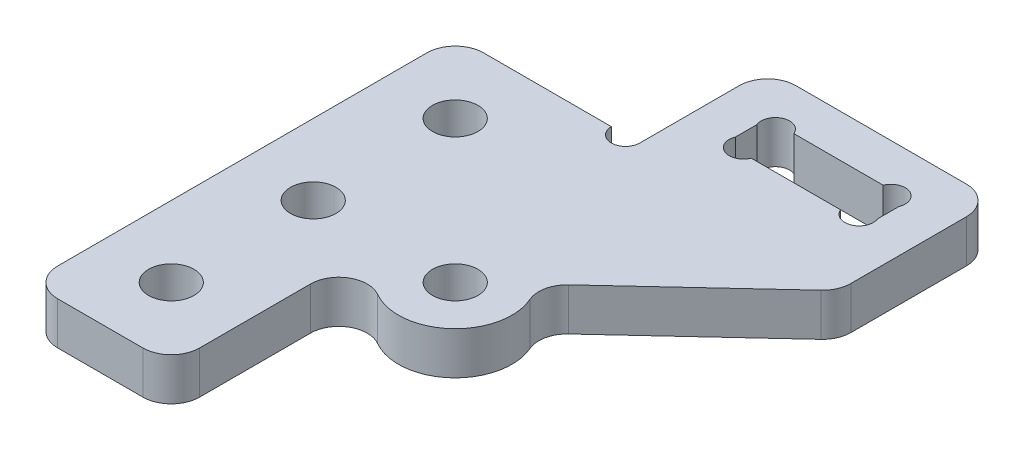
ISO-10303-21;
HEADER;
FILE_DESCRIPTION(('STEP AP214'),'2;1');
FILE_NAME('part.step','',(''),(''),'','','');
FILE_SCHEMA(('AUTOMOTIVE_DESIGN { 1 0 10303 214 1 1 1 1 }'));
ENDSEC;
DATA;
#1=APPLICATION_CONTEXT('core data for automotive mechanical design processes');
#2=APPLICATION_PROTOCOL_DEFINITION('international standard','automotive_design',2000,#1);
#3=PRODUCT_CONTEXT('',#1,'mechanical');
#4=PRODUCT('Part','Part','',(#3));
#5=PRODUCT_RELATED_PRODUCT_CATEGORY('part','',(#4));
#6=PRODUCT_DEFINITION_FORMATION('','',#4);
#7=PRODUCT_DEFINITION_CONTEXT('part definition',#1,'design');
#8=PRODUCT_DEFINITION('design','',#6,#7);
#9=PRODUCT_DEFINITION_SHAPE('','',#8);
#10=(LENGTH_UNIT() NAMED_UNIT(*) SI_UNIT(.MILLI.,.METRE.));
#11=(NAMED_UNIT(*) PLANE_ANGLE_UNIT() SI_UNIT($,.RADIAN.));
#12=(NAMED_UNIT(*) SI_UNIT($,.STERADIAN.) SOLID_ANGLE_UNIT());
#13=UNCERTAINTY_MEASURE_WITH_UNIT(LENGTH_MEASURE(1.E-05),#10,'distance_accuracy_value','');
#14=(GEOMETRIC_REPRESENTATION_CONTEXT(3) GLOBAL_UNCERTAINTY_ASSIGNED_CONTEXT((#13)) GLOBAL_UNIT_ASSIGNED_CONTEXT((#10,
#11,#12)) REPRESENTATION_CONTEXT('',''));
#15=CARTESIAN_POINT('',(0.,0.,0.));
#16=DIRECTION('',(0.,0.,1.));
#17=DIRECTION('',(1.,0.,0.));
#18=AXIS2_PLACEMENT_3D('',#15,#16,#17);
#19=CARTESIAN_POINT('',(0.,3.,0.));
#20=DIRECTION('',(0.,-1.,0.));
#21=DIRECTION('',(0.,0.,-1.));
#22=AXIS2_PLACEMENT_3D('',#19,#20,#21);
#23=PLANE('',#22);
#24=DIRECTION('',(-1.,0.,0.));
#25=VECTOR('',#24,1.);
#26=CARTESIAN_POINT('',(24.,3.,-24.));
#27=LINE('',#26,#25);
#28=CARTESIAN_POINT('',(22.,3.,-24.));
#29=VERTEX_POINT('',#28);
#30=CARTESIAN_POINT('',(10.,3.,-24.));
#31=VERTEX_POINT('',#30);
#32=EDGE_CURVE('E411',#29,#31,#27,.T.);
#33=ORIENTED_EDGE('',*,*,#32,.T.);
#34=CARTESIAN_POINT('',(10.,3.,-22.));
#35=DIRECTION('',(0.,-1.,0.));
#36=DIRECTION('',(0.,0.,-1.));
#37=AXIS2_PLACEMENT_3D('',#34,#35,#36);
#38=CIRCLE('',#37,2.);
#39=CARTESIAN_POINT('',(8.,3.,-22.));
#40=VERTEX_POINT('',#39);
#41=EDGE_CURVE('E358',#31,#40,#38,.F.);
#42=ORIENTED_EDGE('',*,*,#41,.T.);
#43=DIRECTION('',(0.,0.,1.));
#44=VECTOR('',#43,1.);
#45=CARTESIAN_POINT('',(8.,3.,-15.));
#46=LINE('',#45,#44);
#47=CARTESIAN_POINT('',(8.,3.,-15.));
#48=VERTEX_POINT('',#47);
#49=EDGE_CURVE('E431',#40,#48,#46,.T.);
#50=ORIENTED_EDGE('',*,*,#49,.T.);
#51=CARTESIAN_POINT('',(7.,3.,-15.));
#52=DIRECTION('',(0.,-1.,0.));
#53=DIRECTION('',(0.,0.,-1.));
#54=AXIS2_PLACEMENT_3D('',#51,#52,#53);
#55=CIRCLE('',#54,1.);
#56=CARTESIAN_POINT('',(6.,3.,-15.));
#57=VERTEX_POINT('',#56);
#58=EDGE_CURVE('E457',#48,#57,#55,.T.);
#59=ORIENTED_EDGE('',*,*,#58,.T.);
#60=DIRECTION('',(-1.,0.,0.));
#61=VECTOR('',#60,1.);
#62=CARTESIAN_POINT('',(-5.,3.,-15.));
#63=LINE('',#62,#61);
#64=CARTESIAN_POINT('',(-3.,3.,-15.));
#65=VERTEX_POINT('',#64);
#66=EDGE_CURVE('E300',#57,#65,#63,.T.);
#67=ORIENTED_EDGE('',*,*,#66,.T.);
#68=CARTESIAN_POINT('',(-3.,3.,-13.));
#69=DIRECTION('',(0.,-1.,0.));
#70=DIRECTION('',(0.,0.,-1.));
#71=AXIS2_PLACEMENT_3D('',#68,#69,#70);
#72=CIRCLE('',#71,2.);
#73=CARTESIAN_POINT('',(-5.,3.,-13.));
#74=VERTEX_POINT('',#73);
#75=EDGE_CURVE('E349',#65,#74,#72,.F.);
#76=ORIENTED_EDGE('',*,*,#75,.T.);
#77=DIRECTION('',(0.,0.,1.));
#78=VECTOR('',#77,1.);
#79=CARTESIAN_POINT('',(-5.,3.,15.));
#80=LINE('',#79,#78);
#81=CARTESIAN_POINT('',(-5.,3.,13.));
#82=VERTEX_POINT('',#81);
#83=EDGE_CURVE('E304',#74,#82,#80,.T.);
#84=ORIENTED_EDGE('',*,*,#83,.T.);
#85=CARTESIAN_POINT('',(-3.,3.,13.));
#86=DIRECTION('',(0.,-1.,0.));
#87=DIRECTION('',(0.,0.,-1.));
#88=AXIS2_PLACEMENT_3D('',#85,#86,#87);
#89=CIRCLE('',#88,2.);
#90=CARTESIAN_POINT('',(-3.,3.,15.));
#91=VERTEX_POINT('',#90);
#92=EDGE_CURVE('E351',#82,#91,#89,.F.);
#93=ORIENTED_EDGE('',*,*,#92,.T.);
#94=DIRECTION('',(1.,0.,0.));
#95=VECTOR('',#94,1.);
#96=CARTESIAN_POINT('',(-5.,3.,15.));
#97=LINE('',#96,#95);
#98=CARTESIAN_POINT('',(3.,3.,15.));
#99=VERTEX_POINT('',#98);
#100=EDGE_CURVE('E307',#91,#99,#97,.T.);
#101=ORIENTED_EDGE('',*,*,#100,.T.);
#102=CARTESIAN_POINT('',(3.,3.,13.));
#103=DIRECTION('',(0.,-1.,0.));
#104=DIRECTION('',(0.,0.,-1.));
#105=AXIS2_PLACEMENT_3D('',#102,#103,#104);
#106=CIRCLE('',#105,2.);
#107=CARTESIAN_POINT('',(5.,3.,13.));
#108=VERTEX_POINT('',#107);
#109=EDGE_CURVE('E353',#99,#108,#106,.F.);
#110=ORIENTED_EDGE('',*,*,#109,.T.);
#111=DIRECTION('',(0.,0.,-1.));
#112=VECTOR('',#111,1.);
#113=CARTESIAN_POINT('',(5.,3.,15.));
#114=LINE('',#113,#112);
#115=CARTESIAN_POINT('',(5.,3.,5.19615242270663));
#116=VERTEX_POINT('',#115);
#117=EDGE_CURVE('E298',#108,#116,#114,.T.);
#118=ORIENTED_EDGE('',*,*,#117,.T.);
#119=CARTESIAN_POINT('',(7.,3.,5.19615242270663));
#120=DIRECTION('',(0.,-1.,0.));
#121=DIRECTION('',(0.,0.,-1.));
#122=AXIS2_PLACEMENT_3D('',#119,#120,#121);
#123=CIRCLE('',#122,2.);
#124=CARTESIAN_POINT('',(8.,3.,3.46410161513776));
#125=VERTEX_POINT('',#124);
#126=EDGE_CURVE('E409',#116,#125,#123,.T.);
#127=ORIENTED_EDGE('',*,*,#126,.T.);
#128=CARTESIAN_POINT('',(10.,3.,0.));
#129=DIRECTION('',(0.,-1.,0.));
#130=DIRECTION('',(0.,0.,-1.));
#131=AXIS2_PLACEMENT_3D('',#128,#129,#130);
#132=CIRCLE('',#131,4.);
#133=CARTESIAN_POINT('',(13.6708054505608,3.,-1.58908380651663));
#134=VERTEX_POINT('',#133);
#135=EDGE_CURVE('E403',#125,#134,#132,.F.);
#136=ORIENTED_EDGE('',*,*,#135,.T.);
#137=CARTESIAN_POINT('',(15.5062081758411,3.,-2.38362570977495));
#138=DIRECTION('',(0.,-1.,0.));
#139=DIRECTION('',(0.,0.,-1.));
#140=AXIS2_PLACEMENT_3D('',#137,#138,#139);
#141=CIRCLE('',#140,2.);
#142=CARTESIAN_POINT('',(14.1453059771066,3.,-3.84921269302754));
#143=VERTEX_POINT('',#142);
#144=EDGE_CURVE('E11',#134,#143,#141,.T.);
#145=ORIENTED_EDGE('',*,*,#144,.T.);
#146=DIRECTION('',(0.732793491626299,0.,-0.680451099367278));
#147=VECTOR('',#146,1.);
#148=CARTESIAN_POINT('',(12.9311739665052,3.,-2.72180439746911));
#149=LINE('',#148,#147);
#150=CARTESIAN_POINT('',(23.3609021987346,3.,-12.4065520416821));
#151=VERTEX_POINT('',#150);
#152=EDGE_CURVE('E402',#143,#151,#149,.T.);
#153=ORIENTED_EDGE('',*,*,#152,.T.);
#154=CARTESIAN_POINT('',(22.,3.,-13.8721390249347));
#155=DIRECTION('',(0.,-1.,0.));
#156=DIRECTION('',(0.,0.,-1.));
#157=AXIS2_PLACEMENT_3D('',#154,#155,#156);
#158=CIRCLE('',#157,2.);
#159=CARTESIAN_POINT('',(24.,3.,-13.8721390249347));
#160=VERTEX_POINT('',#159);
#161=EDGE_CURVE('E56',#151,#160,#158,.F.);
#162=ORIENTED_EDGE('',*,*,#161,.T.);
#163=DIRECTION('',(0.,0.,-1.));
#164=VECTOR('',#163,1.);
#165=CARTESIAN_POINT('',(24.,3.,-13.));
#166=LINE('',#165,#164);
#167=CARTESIAN_POINT('',(24.,3.,-22.));
#168=VERTEX_POINT('',#167);
#169=EDGE_CURVE('E407',#160,#168,#166,.T.);
#170=ORIENTED_EDGE('',*,*,#169,.T.);
#171=CARTESIAN_POINT('',(22.,3.,-22.));
#172=DIRECTION('',(0.,-1.,0.));
#173=DIRECTION('',(0.,0.,-1.));
#174=AXIS2_PLACEMENT_3D('',#171,#172,#173);
#175=CIRCLE('',#174,2.);
#176=EDGE_CURVE('E356',#168,#29,#175,.F.);
#177=ORIENTED_EDGE('',*,*,#176,.T.);
#178=EDGE_LOOP('',(#33,#42,#50,#59,#67,#76,#84,#93,#101,#110,#118,#127,#136,#145,#153,#162,#170,#177));
#179=FACE_BOUND('',#178,.T.);
#180=CARTESIAN_POINT('',(0.,3.,0.));
#181=DIRECTION('',(0.,1.,0.));
#182=DIRECTION('',(0.,0.,1.));
#183=AXIS2_PLACEMENT_3D('',#180,#181,#182);
#184=CIRCLE('',#183,1.6);
#185=CARTESIAN_POINT('',(0.,3.,1.6));
#186=VERTEX_POINT('',#185);
#187=EDGE_CURVE('E292',#186,#186,#184,.T.);
#188=ORIENTED_EDGE('',*,*,#187,.F.);
#189=EDGE_LOOP('',(#188));
#190=FACE_BOUND('',#189,.T.);
#191=CARTESIAN_POINT('',(0.,3.,-10.));
#192=DIRECTION('',(0.,1.,0.));
#193=DIRECTION('',(0.,0.,1.));
#194=AXIS2_PLACEMENT_3D('',#191,#192,#193);
#195=CIRCLE('',#194,1.6);
#196=CARTESIAN_POINT('',(0.,3.,-8.4));
#197=VERTEX_POINT('',#196);
#198=EDGE_CURVE('E286',#197,#197,#195,.T.);
#199=ORIENTED_EDGE('',*,*,#198,.F.);
#200=EDGE_LOOP('',(#199));
#201=FACE_BOUND('',#200,.T.);
#202=CARTESIAN_POINT('',(0.,3.,10.));
#203=DIRECTION('',(0.,1.,0.));
#204=DIRECTION('',(0.,0.,-1.));
#205=AXIS2_PLACEMENT_3D('',#202,#203,#204);
#206=CIRCLE('',#205,1.6);
#207=CARTESIAN_POINT('',(0.,3.,8.4));
#208=VERTEX_POINT('',#207);
#209=EDGE_CURVE('E280',#208,#208,#206,.T.);
#210=ORIENTED_EDGE('',*,*,#209,.F.);
#211=EDGE_LOOP('',(#210));
#212=FACE_BOUND('',#211,.T.);
#213=CARTESIAN_POINT('',(10.,3.,0.));
#214=DIRECTION('',(0.,-1.,0.));
#215=DIRECTION('',(0.,0.,-1.));
#216=AXIS2_PLACEMENT_3D('',#213,#214,#215);
#217=CIRCLE('',#216,1.6);
#218=CARTESIAN_POINT('',(10.,3.,-1.6));
#219=VERTEX_POINT('',#218);
#220=EDGE_CURVE('E275',#219,#219,#217,.F.);
#221=ORIENTED_EDGE('',*,*,#220,.F.);
#222=EDGE_LOOP('',(#221));
#223=FACE_BOUND('',#222,.T.);
#224=DIRECTION('',(1.,0.,0.));
#225=VECTOR('',#224,1.);
#226=CARTESIAN_POINT('',(11.,3.,-18.));
#227=LINE('',#226,#225);
#228=CARTESIAN_POINT('',(12.8540496217739,3.,-18.));
#229=VERTEX_POINT('',#228);
#230=CARTESIAN_POINT('',(19.1459503782261,3.,-18.));
#231=VERTEX_POINT('',#230);
#232=EDGE_CURVE('E434',#229,#231,#227,.T.);
#233=ORIENTED_EDGE('',*,*,#232,.F.);
#234=CARTESIAN_POINT('',(11.927024810887,3.,-18.375));
#235=DIRECTION('',(0.,-1.,0.));
#236=DIRECTION('',(0.,0.,1.));
#237=AXIS2_PLACEMENT_3D('',#234,#235,#236);
#238=CIRCLE('',#237,1.);
#239=CARTESIAN_POINT('',(11.,3.,-18.75));
#240=VERTEX_POINT('',#239);
#241=EDGE_CURVE('E463',#229,#240,#238,.T.);
#242=ORIENTED_EDGE('',*,*,#241,.T.);
#243=DIRECTION('',(0.,0.,1.));
#244=VECTOR('',#243,1.);
#245=CARTESIAN_POINT('',(11.,3.,-18.));
#246=LINE('',#245,#244);
#247=CARTESIAN_POINT('',(11.,3.,-20.25));
#248=VERTEX_POINT('',#247);
#249=EDGE_CURVE('E415',#248,#240,#246,.T.);
#250=ORIENTED_EDGE('',*,*,#249,.F.);
#251=CARTESIAN_POINT('',(11.927024810887,3.,-20.625));
#252=DIRECTION('',(0.,-1.,0.));
#253=DIRECTION('',(0.,0.,-1.));
#254=AXIS2_PLACEMENT_3D('',#251,#252,#253);
#255=CIRCLE('',#254,1.);
#256=CARTESIAN_POINT('',(12.8540496217739,3.,-21.));
#257=VERTEX_POINT('',#256);
#258=EDGE_CURVE('E218',#248,#257,#255,.T.);
#259=ORIENTED_EDGE('',*,*,#258,.T.);
#260=DIRECTION('',(-1.,0.,0.));
#261=VECTOR('',#260,1.);
#262=CARTESIAN_POINT('',(11.,3.,-21.));
#263=LINE('',#262,#261);
#264=CARTESIAN_POINT('',(19.1459503782261,3.,-21.));
#265=VERTEX_POINT('',#264);
#266=EDGE_CURVE('E228',#265,#257,#263,.T.);
#267=ORIENTED_EDGE('',*,*,#266,.F.);
#268=CARTESIAN_POINT('',(20.072975189113,3.,-20.625));
#269=DIRECTION('',(0.,-1.,0.));
#270=DIRECTION('',(0.,0.,1.));
#271=AXIS2_PLACEMENT_3D('',#268,#269,#270);
#272=CIRCLE('',#271,1.);
#273=CARTESIAN_POINT('',(21.,3.,-20.25));
#274=VERTEX_POINT('',#273);
#275=EDGE_CURVE('E219',#265,#274,#272,.T.);
#276=ORIENTED_EDGE('',*,*,#275,.T.);
#277=DIRECTION('',(0.,0.,-1.));
#278=VECTOR('',#277,1.);
#279=CARTESIAN_POINT('',(21.,3.,-18.));
#280=LINE('',#279,#278);
#281=CARTESIAN_POINT('',(21.,3.,-18.75));
#282=VERTEX_POINT('',#281);
#283=EDGE_CURVE('E279',#282,#274,#280,.T.);
#284=ORIENTED_EDGE('',*,*,#283,.F.);
#285=CARTESIAN_POINT('',(20.072975189113,3.,-18.375));
#286=DIRECTION('',(0.,-1.,0.));
#287=DIRECTION('',(0.,0.,-1.));
#288=AXIS2_PLACEMENT_3D('',#285,#286,#287);
#289=CIRCLE('',#288,1.);
#290=EDGE_CURVE('E230',#282,#231,#289,.T.);
#291=ORIENTED_EDGE('',*,*,#290,.T.);
#292=EDGE_LOOP('',(#233,#242,#250,#259,#267,#276,#284,#291));
#293=FACE_BOUND('',#292,.T.);
#294=ADVANCED_FACE('F34',(#179,#190,#201,#212,#223,#293),#23,.F.);
#295=CARTESIAN_POINT('',(0.,0.,0.));
#296=DIRECTION('',(0.,-1.,0.));
#297=DIRECTION('',(0.,0.,-1.));
#298=AXIS2_PLACEMENT_3D('',#295,#296,#297);
#299=PLANE('',#298);
#300=CARTESIAN_POINT('',(11.927024810887,0.,-18.375));
#301=DIRECTION('',(0.,-1.,0.));
#302=DIRECTION('',(0.,0.,1.));
#303=AXIS2_PLACEMENT_3D('',#300,#301,#302);
#304=CIRCLE('',#303,1.);
#305=CARTESIAN_POINT('',(12.8540496217739,0.,-18.));
#306=VERTEX_POINT('',#305);
#307=CARTESIAN_POINT('',(11.,0.,-18.75));
#308=VERTEX_POINT('',#307);
#309=EDGE_CURVE('E466',#306,#308,#304,.T.);
#310=ORIENTED_EDGE('',*,*,#309,.F.);
#311=DIRECTION('',(-1.,0.,0.));
#312=VECTOR('',#311,1.);
#313=CARTESIAN_POINT('',(11.,0.,-18.));
#314=LINE('',#313,#312);
#315=CARTESIAN_POINT('',(19.1459503782261,0.,-18.));
#316=VERTEX_POINT('',#315);
#317=EDGE_CURVE('E242',#316,#306,#314,.T.);
#318=ORIENTED_EDGE('',*,*,#317,.F.);
#319=CARTESIAN_POINT('',(20.072975189113,0.,-18.375));
#320=DIRECTION('',(0.,-1.,0.));
#321=DIRECTION('',(0.,0.,-1.));
#322=AXIS2_PLACEMENT_3D('',#319,#320,#321);
#323=CIRCLE('',#322,1.);
#324=CARTESIAN_POINT('',(21.,0.,-18.75));
#325=VERTEX_POINT('',#324);
#326=EDGE_CURVE('E465',#325,#316,#323,.T.);
#327=ORIENTED_EDGE('',*,*,#326,.F.);
#328=DIRECTION('',(0.,0.,1.));
#329=VECTOR('',#328,1.);
#330=CARTESIAN_POINT('',(21.,0.,-18.));
#331=LINE('',#330,#329);
#332=CARTESIAN_POINT('',(21.,0.,-20.25));
#333=VERTEX_POINT('',#332);
#334=EDGE_CURVE('E238',#333,#325,#331,.T.);
#335=ORIENTED_EDGE('',*,*,#334,.F.);
#336=CARTESIAN_POINT('',(20.072975189113,0.,-20.625));
#337=DIRECTION('',(0.,-1.,0.));
#338=DIRECTION('',(0.,0.,1.));
#339=AXIS2_PLACEMENT_3D('',#336,#337,#338);
#340=CIRCLE('',#339,1.);
#341=CARTESIAN_POINT('',(19.1459503782261,0.,-21.));
#342=VERTEX_POINT('',#341);
#343=EDGE_CURVE('E237',#342,#333,#340,.T.);
#344=ORIENTED_EDGE('',*,*,#343,.F.);
#345=DIRECTION('',(1.,0.,0.));
#346=VECTOR('',#345,1.);
#347=CARTESIAN_POINT('',(11.,0.,-21.));
#348=LINE('',#347,#346);
#349=CARTESIAN_POINT('',(12.8540496217739,0.,-21.));
#350=VERTEX_POINT('',#349);
#351=EDGE_CURVE('E226',#350,#342,#348,.T.);
#352=ORIENTED_EDGE('',*,*,#351,.F.);
#353=CARTESIAN_POINT('',(11.927024810887,0.,-20.625));
#354=DIRECTION('',(0.,-1.,0.));
#355=DIRECTION('',(0.,0.,-1.));
#356=AXIS2_PLACEMENT_3D('',#353,#354,#355);
#357=CIRCLE('',#356,1.);
#358=CARTESIAN_POINT('',(11.,0.,-20.25));
#359=VERTEX_POINT('',#358);
#360=EDGE_CURVE('E207',#359,#350,#357,.T.);
#361=ORIENTED_EDGE('',*,*,#360,.F.);
#362=DIRECTION('',(0.,0.,-1.));
#363=VECTOR('',#362,1.);
#364=CARTESIAN_POINT('',(11.,0.,-18.));
#365=LINE('',#364,#363);
#366=EDGE_CURVE('E239',#308,#359,#365,.T.);
#367=ORIENTED_EDGE('',*,*,#366,.F.);
#368=EDGE_LOOP('',(#310,#318,#327,#335,#344,#352,#361,#367));
#369=FACE_BOUND('',#368,.T.);
#370=DIRECTION('',(0.,0.,-1.));
#371=VECTOR('',#370,1.);
#372=CARTESIAN_POINT('',(8.,0.,-15.));
#373=LINE('',#372,#371);
#374=CARTESIAN_POINT('',(8.,0.,-15.));
#375=VERTEX_POINT('',#374);
#376=CARTESIAN_POINT('',(8.,0.,-22.));
#377=VERTEX_POINT('',#376);
#378=EDGE_CURVE('E253',#375,#377,#373,.T.);
#379=ORIENTED_EDGE('',*,*,#378,.T.);
#380=CARTESIAN_POINT('',(10.,0.,-22.));
#381=DIRECTION('',(0.,-1.,0.));
#382=DIRECTION('',(0.,0.,-1.));
#383=AXIS2_PLACEMENT_3D('',#380,#381,#382);
#384=CIRCLE('',#383,2.);
#385=CARTESIAN_POINT('',(10.,0.,-24.));
#386=VERTEX_POINT('',#385);
#387=EDGE_CURVE('E342',#377,#386,#384,.T.);
#388=ORIENTED_EDGE('',*,*,#387,.T.);
#389=DIRECTION('',(1.,0.,0.));
#390=VECTOR('',#389,1.);
#391=CARTESIAN_POINT('',(24.,0.,-24.));
#392=LINE('',#391,#390);
#393=CARTESIAN_POINT('',(22.,0.,-24.));
#394=VERTEX_POINT('',#393);
#395=EDGE_CURVE('E256',#386,#394,#392,.T.);
#396=ORIENTED_EDGE('',*,*,#395,.T.);
#397=CARTESIAN_POINT('',(22.,0.,-22.));
#398=DIRECTION('',(0.,-1.,0.));
#399=DIRECTION('',(0.,0.,-1.));
#400=AXIS2_PLACEMENT_3D('',#397,#398,#399);
#401=CIRCLE('',#400,2.);
#402=CARTESIAN_POINT('',(24.,0.,-22.));
#403=VERTEX_POINT('',#402);
#404=EDGE_CURVE('E340',#394,#403,#401,.T.);
#405=ORIENTED_EDGE('',*,*,#404,.T.);
#406=DIRECTION('',(0.,0.,1.));
#407=VECTOR('',#406,1.);
#408=CARTESIAN_POINT('',(24.,0.,-13.));
#409=LINE('',#408,#407);
#410=CARTESIAN_POINT('',(24.,0.,-13.8721390249347));
#411=VERTEX_POINT('',#410);
#412=EDGE_CURVE('E259',#403,#411,#409,.T.);
#413=ORIENTED_EDGE('',*,*,#412,.T.);
#414=CARTESIAN_POINT('',(22.,0.,-13.8721390249347));
#415=DIRECTION('',(0.,-1.,0.));
#416=DIRECTION('',(0.,0.,-1.));
#417=AXIS2_PLACEMENT_3D('',#414,#415,#416);
#418=CIRCLE('',#417,2.);
#419=CARTESIAN_POINT('',(23.3609021987346,0.,-12.4065520416821));
#420=VERTEX_POINT('',#419);
#421=EDGE_CURVE('E338',#411,#420,#418,.T.);
#422=ORIENTED_EDGE('',*,*,#421,.T.);
#423=DIRECTION('',(-0.732793491626299,0.,0.680451099367278));
#424=VECTOR('',#423,1.);
#425=CARTESIAN_POINT('',(12.9311739665052,0.,-2.72180439746911));
#426=LINE('',#425,#424);
#427=CARTESIAN_POINT('',(14.1453059771066,0.,-3.84921269302754));
#428=VERTEX_POINT('',#427);
#429=EDGE_CURVE('E262',#420,#428,#426,.T.);
#430=ORIENTED_EDGE('',*,*,#429,.T.);
#431=CARTESIAN_POINT('',(15.5062081758411,0.,-2.38362570977495));
#432=DIRECTION('',(0.,-1.,0.));
#433=DIRECTION('',(0.,0.,-1.));
#434=AXIS2_PLACEMENT_3D('',#431,#432,#433);
#435=CIRCLE('',#434,2.);
#436=CARTESIAN_POINT('',(13.6708054505608,0.,-1.58908380651663));
#437=VERTEX_POINT('',#436);
#438=EDGE_CURVE('E42',#428,#437,#435,.F.);
#439=ORIENTED_EDGE('',*,*,#438,.T.);
#440=CARTESIAN_POINT('',(10.,0.,0.));
#441=DIRECTION('',(0.,-1.,0.));
#442=DIRECTION('',(0.,0.,-1.));
#443=AXIS2_PLACEMENT_3D('',#440,#441,#442);
#444=CIRCLE('',#443,4.);
#445=CARTESIAN_POINT('',(8.,0.,3.46410161513776));
#446=VERTEX_POINT('',#445);
#447=EDGE_CURVE('E265',#437,#446,#444,.T.);
#448=ORIENTED_EDGE('',*,*,#447,.T.);
#449=CARTESIAN_POINT('',(7.,0.,5.19615242270663));
#450=DIRECTION('',(0.,1.,0.));
#451=DIRECTION('',(0.,0.,-1.));
#452=AXIS2_PLACEMENT_3D('',#449,#450,#451);
#453=CIRCLE('',#452,2.);
#454=CARTESIAN_POINT('',(5.,0.,5.19615242270663));
#455=VERTEX_POINT('',#454);
#456=EDGE_CURVE('E250',#446,#455,#453,.T.);
#457=ORIENTED_EDGE('',*,*,#456,.T.);
#458=DIRECTION('',(0.,0.,-1.));
#459=VECTOR('',#458,1.);
#460=CARTESIAN_POINT('',(5.,0.,15.));
#461=LINE('',#460,#459);
#462=CARTESIAN_POINT('',(5.,0.,13.));
#463=VERTEX_POINT('',#462);
#464=EDGE_CURVE('E295',#463,#455,#461,.T.);
#465=ORIENTED_EDGE('',*,*,#464,.F.);
#466=CARTESIAN_POINT('',(3.,0.,13.));
#467=DIRECTION('',(0.,-1.,0.));
#468=DIRECTION('',(0.,0.,-1.));
#469=AXIS2_PLACEMENT_3D('',#466,#467,#468);
#470=CIRCLE('',#469,2.);
#471=CARTESIAN_POINT('',(3.,0.,15.));
#472=VERTEX_POINT('',#471);
#473=EDGE_CURVE('E336',#463,#472,#470,.T.);
#474=ORIENTED_EDGE('',*,*,#473,.T.);
#475=DIRECTION('',(1.,0.,0.));
#476=VECTOR('',#475,1.);
#477=CARTESIAN_POINT('',(-5.,0.,15.));
#478=LINE('',#477,#476);
#479=CARTESIAN_POINT('',(-3.,0.,15.));
#480=VERTEX_POINT('',#479);
#481=EDGE_CURVE('E301',#480,#472,#478,.T.);
#482=ORIENTED_EDGE('',*,*,#481,.F.);
#483=CARTESIAN_POINT('',(-3.,0.,13.));
#484=DIRECTION('',(0.,-1.,0.));
#485=DIRECTION('',(0.,0.,-1.));
#486=AXIS2_PLACEMENT_3D('',#483,#484,#485);
#487=CIRCLE('',#486,2.);
#488=CARTESIAN_POINT('',(-5.,0.,13.));
#489=VERTEX_POINT('',#488);
#490=EDGE_CURVE('E334',#480,#489,#487,.T.);
#491=ORIENTED_EDGE('',*,*,#490,.T.);
#492=DIRECTION('',(0.,0.,1.));
#493=VECTOR('',#492,1.);
#494=CARTESIAN_POINT('',(-5.,0.,15.));
#495=LINE('',#494,#493);
#496=CARTESIAN_POINT('',(-5.,0.,-13.));
#497=VERTEX_POINT('',#496);
#498=EDGE_CURVE('E314',#497,#489,#495,.T.);
#499=ORIENTED_EDGE('',*,*,#498,.F.);
#500=CARTESIAN_POINT('',(-3.,0.,-13.));
#501=DIRECTION('',(0.,-1.,0.));
#502=DIRECTION('',(0.,0.,-1.));
#503=AXIS2_PLACEMENT_3D('',#500,#501,#502);
#504=CIRCLE('',#503,2.);
#505=CARTESIAN_POINT('',(-3.,0.,-15.));
#506=VERTEX_POINT('',#505);
#507=EDGE_CURVE('E332',#497,#506,#504,.T.);
#508=ORIENTED_EDGE('',*,*,#507,.T.);
#509=DIRECTION('',(-1.,0.,0.));
#510=VECTOR('',#509,1.);
#511=CARTESIAN_POINT('',(-5.,0.,-15.));
#512=LINE('',#511,#510);
#513=CARTESIAN_POINT('',(6.,0.,-15.));
#514=VERTEX_POINT('',#513);
#515=EDGE_CURVE('E311',#514,#506,#512,.T.);
#516=ORIENTED_EDGE('',*,*,#515,.F.);
#517=CARTESIAN_POINT('',(7.,0.,-15.));
#518=DIRECTION('',(0.,-1.,0.));
#519=DIRECTION('',(0.,0.,-1.));
#520=AXIS2_PLACEMENT_3D('',#517,#518,#519);
#521=CIRCLE('',#520,1.);
#522=EDGE_CURVE('E455',#375,#514,#521,.T.);
#523=ORIENTED_EDGE('',*,*,#522,.F.);
#524=EDGE_LOOP('',(#379,#388,#396,#405,#413,#422,#430,#439,#448,#457,#465,#474,#482,#491,#499,
#508,#516,#523));
#525=FACE_BOUND('',#524,.T.);
#526=CARTESIAN_POINT('',(0.,0.,-10.));
#527=DIRECTION('',(0.,1.,0.));
#528=DIRECTION('',(0.,0.,1.));
#529=AXIS2_PLACEMENT_3D('',#526,#527,#528);
#530=CIRCLE('',#529,1.6);
#531=CARTESIAN_POINT('',(0.,0.,-8.4));
#532=VERTEX_POINT('',#531);
#533=EDGE_CURVE('E283',#532,#532,#530,.T.);
#534=ORIENTED_EDGE('',*,*,#533,.T.);
#535=EDGE_LOOP('',(#534));
#536=FACE_BOUND('',#535,.T.);
#537=CARTESIAN_POINT('',(0.,0.,0.));
#538=DIRECTION('',(0.,1.,0.));
#539=DIRECTION('',(0.,0.,1.));
#540=AXIS2_PLACEMENT_3D('',#537,#538,#539);
#541=CIRCLE('',#540,1.6);
#542=CARTESIAN_POINT('',(0.,0.,1.6));
#543=VERTEX_POINT('',#542);
#544=EDGE_CURVE('E289',#543,#543,#541,.T.);
#545=ORIENTED_EDGE('',*,*,#544,.T.);
#546=EDGE_LOOP('',(#545));
#547=FACE_BOUND('',#546,.T.);
#548=CARTESIAN_POINT('',(0.,0.,10.));
#549=DIRECTION('',(0.,1.,0.));
#550=DIRECTION('',(0.,0.,-1.));
#551=AXIS2_PLACEMENT_3D('',#548,#549,#550);
#552=CIRCLE('',#551,1.6);
#553=CARTESIAN_POINT('',(0.,0.,8.4));
#554=VERTEX_POINT('',#553);
#555=EDGE_CURVE('E278',#554,#554,#552,.T.);
#556=ORIENTED_EDGE('',*,*,#555,.T.);
#557=EDGE_LOOP('',(#556));
#558=FACE_BOUND('',#557,.T.);
#559=CARTESIAN_POINT('',(10.,0.,0.));
#560=DIRECTION('',(0.,-1.,0.));
#561=DIRECTION('',(0.,0.,-1.));
#562=AXIS2_PLACEMENT_3D('',#559,#560,#561);
#563=CIRCLE('',#562,1.6);
#564=CARTESIAN_POINT('',(10.,0.,-1.6));
#565=VERTEX_POINT('',#564);
#566=EDGE_CURVE('E244',#565,#565,#563,.T.);
#567=ORIENTED_EDGE('',*,*,#566,.F.);
#568=EDGE_LOOP('',(#567));
#569=FACE_BOUND('',#568,.T.);
#570=ADVANCED_FACE('F234',(#369,#525,#536,#547,#558,#569),#299,.T.);
#571=CARTESIAN_POINT('',(5.,3.,15.));
#572=DIRECTION('',(-1.,0.,0.));
#573=DIRECTION('',(0.,0.,1.));
#574=AXIS2_PLACEMENT_3D('',#571,#572,#573);
#575=PLANE('',#574);
#576=ORIENTED_EDGE('',*,*,#117,.F.);
#577=DIRECTION('',(0.,-1.,0.));
#578=VECTOR('',#577,1.);
#579=CARTESIAN_POINT('',(5.,3.,13.));
#580=LINE('',#579,#578);
#581=EDGE_CURVE('E371',#108,#463,#580,.T.);
#582=ORIENTED_EDGE('',*,*,#581,.T.);
#583=ORIENTED_EDGE('',*,*,#464,.T.);
#584=DIRECTION('',(0.,-1.,0.));
#585=VECTOR('',#584,1.);
#586=CARTESIAN_POINT('',(5.,37.8341113894114,5.19615242270663));
#587=LINE('',#586,#585);
#588=EDGE_CURVE('E267',#116,#455,#587,.T.);
#589=ORIENTED_EDGE('',*,*,#588,.F.);
#590=EDGE_LOOP('',(#576,#582,#583,#589));
#591=FACE_BOUND('',#590,.T.);
#592=ADVANCED_FACE('F512',(#591),#575,.F.);
#593=CARTESIAN_POINT('',(-5.,3.,-15.));
#594=DIRECTION('',(0.,0.,1.));
#595=DIRECTION('',(1.,0.,0.));
#596=AXIS2_PLACEMENT_3D('',#593,#594,#595);
#597=PLANE('',#596);
#598=ORIENTED_EDGE('',*,*,#515,.T.);
#599=DIRECTION('',(0.,-1.,0.));
#600=VECTOR('',#599,1.);
#601=CARTESIAN_POINT('',(-3.,3.,-15.));
#602=LINE('',#601,#600);
#603=EDGE_CURVE('E384',#506,#65,#602,.F.);
#604=ORIENTED_EDGE('',*,*,#603,.T.);
#605=ORIENTED_EDGE('',*,*,#66,.F.);
#606=DIRECTION('',(0.,-1.,0.));
#607=VECTOR('',#606,1.);
#608=CARTESIAN_POINT('',(6.,3.,-15.));
#609=LINE('',#608,#607);
#610=EDGE_CURVE('E417',#57,#514,#609,.T.);
#611=ORIENTED_EDGE('',*,*,#610,.T.);
#612=EDGE_LOOP('',(#598,#604,#605,#611));
#613=FACE_BOUND('',#612,.T.);
#614=ADVANCED_FACE('F525',(#613),#597,.F.);
#615=CARTESIAN_POINT('',(-5.,3.,15.));
#616=DIRECTION('',(1.,0.,0.));
#617=DIRECTION('',(0.,0.,-1.));
#618=AXIS2_PLACEMENT_3D('',#615,#616,#617);
#619=PLANE('',#618);
#620=ORIENTED_EDGE('',*,*,#498,.T.);
#621=DIRECTION('',(0.,-1.,0.));
#622=VECTOR('',#621,1.);
#623=CARTESIAN_POINT('',(-5.,3.,13.));
#624=LINE('',#623,#622);
#625=EDGE_CURVE('E382',#489,#82,#624,.F.);
#626=ORIENTED_EDGE('',*,*,#625,.T.);
#627=ORIENTED_EDGE('',*,*,#83,.F.);
#628=DIRECTION('',(0.,-1.,0.));
#629=VECTOR('',#628,1.);
#630=CARTESIAN_POINT('',(-5.,3.,-13.));
#631=LINE('',#630,#629);
#632=EDGE_CURVE('E379',#74,#497,#631,.T.);
#633=ORIENTED_EDGE('',*,*,#632,.T.);
#634=EDGE_LOOP('',(#620,#626,#627,#633));
#635=FACE_BOUND('',#634,.T.);
#636=ADVANCED_FACE('F521',(#635),#619,.F.);
#637=CARTESIAN_POINT('',(-5.,3.,15.));
#638=DIRECTION('',(0.,0.,-1.));
#639=DIRECTION('',(-1.,0.,0.));
#640=AXIS2_PLACEMENT_3D('',#637,#638,#639);
#641=PLANE('',#640);
#642=ORIENTED_EDGE('',*,*,#481,.T.);
#643=DIRECTION('',(0.,-1.,0.));
#644=VECTOR('',#643,1.);
#645=CARTESIAN_POINT('',(3.,3.,15.));
#646=LINE('',#645,#644);
#647=EDGE_CURVE('E377',#472,#99,#646,.F.);
#648=ORIENTED_EDGE('',*,*,#647,.T.);
#649=ORIENTED_EDGE('',*,*,#100,.F.);
#650=DIRECTION('',(0.,-1.,0.));
#651=VECTOR('',#650,1.);
#652=CARTESIAN_POINT('',(-3.,3.,15.));
#653=LINE('',#652,#651);
#654=EDGE_CURVE('E374',#91,#480,#653,.T.);
#655=ORIENTED_EDGE('',*,*,#654,.T.);
#656=EDGE_LOOP('',(#642,#648,#649,#655));
#657=FACE_BOUND('',#656,.T.);
#658=ADVANCED_FACE('F518',(#657),#641,.F.);
#659=CARTESIAN_POINT('',(0.,3.,0.));
#660=DIRECTION('',(0.,-1.,0.));
#661=DIRECTION('',(0.,0.,-1.));
#662=AXIS2_PLACEMENT_3D('',#659,#660,#661);
#663=CYLINDRICAL_SURFACE('',#662,1.6);
#664=ORIENTED_EDGE('',*,*,#187,.T.);
#665=EDGE_LOOP('',(#664));
#666=FACE_BOUND('',#665,.T.);
#667=ORIENTED_EDGE('',*,*,#544,.F.);
#668=EDGE_LOOP('',(#667));
#669=FACE_BOUND('',#668,.T.);
#670=ADVANCED_FACE('F515',(#666,#669),#663,.F.);
#671=CARTESIAN_POINT('',(0.,3.,-10.));
#672=DIRECTION('',(0.,-1.,0.));
#673=DIRECTION('',(0.,0.,-1.));
#674=AXIS2_PLACEMENT_3D('',#671,#672,#673);
#675=CYLINDRICAL_SURFACE('',#674,1.6);
#676=ORIENTED_EDGE('',*,*,#198,.T.);
#677=EDGE_LOOP('',(#676));
#678=FACE_BOUND('',#677,.T.);
#679=ORIENTED_EDGE('',*,*,#533,.F.);
#680=EDGE_LOOP('',(#679));
#681=FACE_BOUND('',#680,.T.);
#682=ADVANCED_FACE('F602',(#678,#681),#675,.F.);
#683=CARTESIAN_POINT('',(0.,3.,10.));
#684=DIRECTION('',(0.,-1.,0.));
#685=DIRECTION('',(0.,0.,-1.));
#686=AXIS2_PLACEMENT_3D('',#683,#684,#685);
#687=CYLINDRICAL_SURFACE('',#686,1.6);
#688=ORIENTED_EDGE('',*,*,#209,.T.);
#689=EDGE_LOOP('',(#688));
#690=FACE_BOUND('',#689,.T.);
#691=ORIENTED_EDGE('',*,*,#555,.F.);
#692=EDGE_LOOP('',(#691));
#693=FACE_BOUND('',#692,.T.);
#694=ADVANCED_FACE('F600',(#690,#693),#687,.F.);
#695=CARTESIAN_POINT('',(8.,37.8341113894114,-15.));
#696=DIRECTION('',(-1.,0.,0.));
#697=DIRECTION('',(0.,0.,1.));
#698=AXIS2_PLACEMENT_3D('',#695,#696,#697);
#699=PLANE('',#698);
#700=ORIENTED_EDGE('',*,*,#49,.F.);
#701=DIRECTION('',(0.,-1.,0.));
#702=VECTOR('',#701,1.);
#703=CARTESIAN_POINT('',(8.,37.8341113894114,-22.));
#704=LINE('',#703,#702);
#705=EDGE_CURVE('E329',#40,#377,#704,.T.);
#706=ORIENTED_EDGE('',*,*,#705,.T.);
#707=ORIENTED_EDGE('',*,*,#378,.F.);
#708=DIRECTION('',(0.,-1.,0.));
#709=VECTOR('',#708,1.);
#710=CARTESIAN_POINT('',(8.,37.8341113894114,-15.));
#711=LINE('',#710,#709);
#712=EDGE_CURVE('E271',#48,#375,#711,.T.);
#713=ORIENTED_EDGE('',*,*,#712,.F.);
#714=EDGE_LOOP('',(#700,#706,#707,#713));
#715=FACE_BOUND('',#714,.T.);
#716=ADVANCED_FACE('F451',(#715),#699,.T.);
#717=CARTESIAN_POINT('',(24.,37.8341113894114,-24.));
#718=DIRECTION('',(0.,0.,-1.));
#719=DIRECTION('',(-1.,0.,0.));
#720=AXIS2_PLACEMENT_3D('',#717,#718,#719);
#721=PLANE('',#720);
#722=ORIENTED_EDGE('',*,*,#395,.F.);
#723=DIRECTION('',(0.,-1.,0.));
#724=VECTOR('',#723,1.);
#725=CARTESIAN_POINT('',(10.,37.8341113894114,-24.));
#726=LINE('',#725,#724);
#727=EDGE_CURVE('E347',#386,#31,#726,.F.);
#728=ORIENTED_EDGE('',*,*,#727,.T.);
#729=ORIENTED_EDGE('',*,*,#32,.F.);
#730=DIRECTION('',(0.,-1.,0.));
#731=VECTOR('',#730,1.);
#732=CARTESIAN_POINT('',(22.,37.8341113894114,-24.));
#733=LINE('',#732,#731);
#734=EDGE_CURVE('E344',#29,#394,#733,.T.);
#735=ORIENTED_EDGE('',*,*,#734,.T.);
#736=EDGE_LOOP('',(#722,#728,#729,#735));
#737=FACE_BOUND('',#736,.T.);
#738=ADVANCED_FACE('F751',(#737),#721,.T.);
#739=CARTESIAN_POINT('',(24.,37.8341113894114,-13.));
#740=DIRECTION('',(1.,0.,0.));
#741=DIRECTION('',(0.,0.,-1.));
#742=AXIS2_PLACEMENT_3D('',#739,#740,#741);
#743=PLANE('',#742);
#744=ORIENTED_EDGE('',*,*,#412,.F.);
#745=DIRECTION('',(0.,-1.,0.));
#746=VECTOR('',#745,1.);
#747=CARTESIAN_POINT('',(24.,37.8341113894114,-22.));
#748=LINE('',#747,#746);
#749=EDGE_CURVE('E49',#403,#168,#748,.F.);
#750=ORIENTED_EDGE('',*,*,#749,.T.);
#751=ORIENTED_EDGE('',*,*,#169,.F.);
#752=DIRECTION('',(0.,-1.,0.));
#753=VECTOR('',#752,1.);
#754=CARTESIAN_POINT('',(24.,37.8341113894114,-13.8721390249347));
#755=LINE('',#754,#753);
#756=EDGE_CURVE('E360',#160,#411,#755,.T.);
#757=ORIENTED_EDGE('',*,*,#756,.T.);
#758=EDGE_LOOP('',(#744,#750,#751,#757));
#759=FACE_BOUND('',#758,.T.);
#760=ADVANCED_FACE('F758',(#759),#743,.T.);
#761=CARTESIAN_POINT('',(12.9311739665052,37.8341113894114,-2.72180439746911));
#762=DIRECTION('',(0.680451099367278,0.,0.732793491626299));
#763=DIRECTION('',(0.732793491626299,0.,-0.680451099367278));
#764=AXIS2_PLACEMENT_3D('',#761,#762,#763);
#765=PLANE('',#764);
#766=ORIENTED_EDGE('',*,*,#429,.F.);
#767=DIRECTION('',(0.,-1.,0.));
#768=VECTOR('',#767,1.);
#769=CARTESIAN_POINT('',(23.3609021987346,37.8341113894114,-12.4065520416821));
#770=LINE('',#769,#768);
#771=EDGE_CURVE('E367',#420,#151,#770,.F.);
#772=ORIENTED_EDGE('',*,*,#771,.T.);
#773=ORIENTED_EDGE('',*,*,#152,.F.);
#774=DIRECTION('',(0.,1.,0.));
#775=VECTOR('',#774,1.);
#776=CARTESIAN_POINT('',(14.1453059771066,0.,-3.84921269302755));
#777=LINE('',#776,#775);
#778=EDGE_CURVE('E364',#143,#428,#777,.F.);
#779=ORIENTED_EDGE('',*,*,#778,.T.);
#780=EDGE_LOOP('',(#766,#772,#773,#779));
#781=FACE_BOUND('',#780,.T.);
#782=ADVANCED_FACE('F405',(#781),#765,.T.);
#783=CARTESIAN_POINT('',(10.,37.8341113894114,0.));
#784=DIRECTION('',(0.,-1.,0.));
#785=DIRECTION('',(0.,0.,-1.));
#786=AXIS2_PLACEMENT_3D('',#783,#784,#785);
#787=CYLINDRICAL_SURFACE('',#786,4.);
#788=ORIENTED_EDGE('',*,*,#447,.F.);
#789=DIRECTION('',(0.,-1.,0.));
#790=VECTOR('',#789,1.);
#791=CARTESIAN_POINT('',(13.6708054505608,37.8341113894114,-1.58908380651663));
#792=LINE('',#791,#790);
#793=EDGE_CURVE('E369',#437,#134,#792,.F.);
#794=ORIENTED_EDGE('',*,*,#793,.T.);
#795=ORIENTED_EDGE('',*,*,#135,.F.);
#796=DIRECTION('',(0.,-1.,0.));
#797=VECTOR('',#796,1.);
#798=CARTESIAN_POINT('',(8.,37.8341113894114,3.46410161513776));
#799=LINE('',#798,#797);
#800=EDGE_CURVE('E268',#125,#446,#799,.T.);
#801=ORIENTED_EDGE('',*,*,#800,.T.);
#802=EDGE_LOOP('',(#788,#794,#795,#801));
#803=FACE_BOUND('',#802,.T.);
#804=ADVANCED_FACE('F392',(#803),#787,.T.);
#805=CARTESIAN_POINT('',(7.,37.8341113894114,5.19615242270663));
#806=DIRECTION('',(0.,-1.,0.));
#807=DIRECTION('',(0.,0.,-1.));
#808=AXIS2_PLACEMENT_3D('',#805,#806,#807);
#809=CYLINDRICAL_SURFACE('',#808,2.);
#810=ORIENTED_EDGE('',*,*,#126,.F.);
#811=ORIENTED_EDGE('',*,*,#588,.T.);
#812=ORIENTED_EDGE('',*,*,#456,.F.);
#813=ORIENTED_EDGE('',*,*,#800,.F.);
#814=EDGE_LOOP('',(#810,#811,#812,#813));
#815=FACE_BOUND('',#814,.T.);
#816=ADVANCED_FACE('F569',(#815),#809,.F.);
#817=CARTESIAN_POINT('',(11.,37.8341113894114,-21.));
#818=DIRECTION('',(0.,0.,-1.));
#819=DIRECTION('',(-1.,0.,0.));
#820=AXIS2_PLACEMENT_3D('',#817,#818,#819);
#821=PLANE('',#820);
#822=ORIENTED_EDGE('',*,*,#266,.T.);
#823=DIRECTION('',(0.,-1.,0.));
#824=VECTOR('',#823,1.);
#825=CARTESIAN_POINT('',(12.8540496217739,3.,-21.));
#826=LINE('',#825,#824);
#827=EDGE_CURVE('E210',#257,#350,#826,.T.);
#828=ORIENTED_EDGE('',*,*,#827,.T.);
#829=ORIENTED_EDGE('',*,*,#351,.T.);
#830=DIRECTION('',(0.,-1.,0.));
#831=VECTOR('',#830,1.);
#832=CARTESIAN_POINT('',(19.1459503782261,3.,-21.));
#833=LINE('',#832,#831);
#834=EDGE_CURVE('E421',#342,#265,#833,.F.);
#835=ORIENTED_EDGE('',*,*,#834,.T.);
#836=EDGE_LOOP('',(#822,#828,#829,#835));
#837=FACE_BOUND('',#836,.T.);
#838=ADVANCED_FACE('F224',(#837),#821,.F.);
#839=CARTESIAN_POINT('',(21.,37.8341113894114,-18.));
#840=DIRECTION('',(1.,0.,0.));
#841=DIRECTION('',(0.,0.,-1.));
#842=AXIS2_PLACEMENT_3D('',#839,#840,#841);
#843=PLANE('',#842);
#844=ORIENTED_EDGE('',*,*,#283,.T.);
#845=DIRECTION('',(0.,-1.,0.));
#846=VECTOR('',#845,1.);
#847=CARTESIAN_POINT('',(21.,3.,-20.25));
#848=LINE('',#847,#846);
#849=EDGE_CURVE('E326',#274,#333,#848,.T.);
#850=ORIENTED_EDGE('',*,*,#849,.T.);
#851=ORIENTED_EDGE('',*,*,#334,.T.);
#852=DIRECTION('',(0.,-1.,0.));
#853=VECTOR('',#852,1.);
#854=CARTESIAN_POINT('',(21.,3.,-18.75));
#855=LINE('',#854,#853);
#856=EDGE_CURVE('E426',#325,#282,#855,.F.);
#857=ORIENTED_EDGE('',*,*,#856,.T.);
#858=EDGE_LOOP('',(#844,#850,#851,#857));
#859=FACE_BOUND('',#858,.T.);
#860=ADVANCED_FACE('F475',(#859),#843,.F.);
#861=CARTESIAN_POINT('',(11.,37.8341113894114,-18.));
#862=DIRECTION('',(0.,0.,1.));
#863=DIRECTION('',(1.,0.,0.));
#864=AXIS2_PLACEMENT_3D('',#861,#862,#863);
#865=PLANE('',#864);
#866=ORIENTED_EDGE('',*,*,#317,.T.);
#867=DIRECTION('',(0.,-1.,0.));
#868=VECTOR('',#867,1.);
#869=CARTESIAN_POINT('',(12.8540496217739,3.,-18.));
#870=LINE('',#869,#868);
#871=EDGE_CURVE('E229',#306,#229,#870,.F.);
#872=ORIENTED_EDGE('',*,*,#871,.T.);
#873=ORIENTED_EDGE('',*,*,#232,.T.);
#874=DIRECTION('',(0.,-1.,0.));
#875=VECTOR('',#874,1.);
#876=CARTESIAN_POINT('',(19.1459503782261,3.,-18.));
#877=LINE('',#876,#875);
#878=EDGE_CURVE('E323',#231,#316,#877,.T.);
#879=ORIENTED_EDGE('',*,*,#878,.T.);
#880=EDGE_LOOP('',(#866,#872,#873,#879));
#881=FACE_BOUND('',#880,.T.);
#882=ADVANCED_FACE('F488',(#881),#865,.F.);
#883=CARTESIAN_POINT('',(11.,37.8341113894114,-18.));
#884=DIRECTION('',(-1.,0.,0.));
#885=DIRECTION('',(0.,0.,1.));
#886=AXIS2_PLACEMENT_3D('',#883,#884,#885);
#887=PLANE('',#886);
#888=ORIENTED_EDGE('',*,*,#249,.T.);
#889=DIRECTION('',(0.,-1.,0.));
#890=VECTOR('',#889,1.);
#891=CARTESIAN_POINT('',(11.,3.,-18.75));
#892=LINE('',#891,#890);
#893=EDGE_CURVE('E320',#240,#308,#892,.T.);
#894=ORIENTED_EDGE('',*,*,#893,.T.);
#895=ORIENTED_EDGE('',*,*,#366,.T.);
#896=DIRECTION('',(0.,-1.,0.));
#897=VECTOR('',#896,1.);
#898=CARTESIAN_POINT('',(11.,3.,-20.25));
#899=LINE('',#898,#897);
#900=EDGE_CURVE('E213',#359,#248,#899,.F.);
#901=ORIENTED_EDGE('',*,*,#900,.T.);
#902=EDGE_LOOP('',(#888,#894,#895,#901));
#903=FACE_BOUND('',#902,.T.);
#904=ADVANCED_FACE('F494',(#903),#887,.F.);
#905=CARTESIAN_POINT('',(10.,37.8341113894114,0.));
#906=DIRECTION('',(0.,-1.,0.));
#907=DIRECTION('',(0.,0.,-1.));
#908=AXIS2_PLACEMENT_3D('',#905,#906,#907);
#909=CYLINDRICAL_SURFACE('',#908,1.6);
#910=ORIENTED_EDGE('',*,*,#220,.T.);
#911=EDGE_LOOP('',(#910));
#912=FACE_BOUND('',#911,.T.);
#913=ORIENTED_EDGE('',*,*,#566,.T.);
#914=EDGE_LOOP('',(#913));
#915=FACE_BOUND('',#914,.T.);
#916=ADVANCED_FACE('F496',(#912,#915),#909,.F.);
#917=CARTESIAN_POINT('',(11.927024810887,3.,-20.625));
#918=DIRECTION('',(0.,-1.,0.));
#919=DIRECTION('',(0.,0.,-1.));
#920=AXIS2_PLACEMENT_3D('',#917,#918,#919);
#921=CYLINDRICAL_SURFACE('',#920,1.);
#922=ORIENTED_EDGE('',*,*,#258,.F.);
#923=ORIENTED_EDGE('',*,*,#900,.F.);
#924=ORIENTED_EDGE('',*,*,#360,.T.);
#925=ORIENTED_EDGE('',*,*,#827,.F.);
#926=EDGE_LOOP('',(#922,#923,#924,#925));
#927=FACE_BOUND('',#926,.T.);
#928=ADVANCED_FACE('F209',(#927),#921,.F.);
#929=CARTESIAN_POINT('',(11.927024810887,3.,-18.375));
#930=DIRECTION('',(0.,-1.,0.));
#931=DIRECTION('',(0.,0.,-1.));
#932=AXIS2_PLACEMENT_3D('',#929,#930,#931);
#933=CYLINDRICAL_SURFACE('',#932,1.);
#934=ORIENTED_EDGE('',*,*,#309,.T.);
#935=ORIENTED_EDGE('',*,*,#893,.F.);
#936=ORIENTED_EDGE('',*,*,#241,.F.);
#937=ORIENTED_EDGE('',*,*,#871,.F.);
#938=EDGE_LOOP('',(#934,#935,#936,#937));
#939=FACE_BOUND('',#938,.T.);
#940=ADVANCED_FACE('F492',(#939),#933,.F.);
#941=CARTESIAN_POINT('',(20.072975189113,3.,-18.375));
#942=DIRECTION('',(0.,-1.,0.));
#943=DIRECTION('',(0.,0.,-1.));
#944=AXIS2_PLACEMENT_3D('',#941,#942,#943);
#945=CYLINDRICAL_SURFACE('',#944,1.);
#946=ORIENTED_EDGE('',*,*,#326,.T.);
#947=ORIENTED_EDGE('',*,*,#878,.F.);
#948=ORIENTED_EDGE('',*,*,#290,.F.);
#949=ORIENTED_EDGE('',*,*,#856,.F.);
#950=EDGE_LOOP('',(#946,#947,#948,#949));
#951=FACE_BOUND('',#950,.T.);
#952=ADVANCED_FACE('F486',(#951),#945,.F.);
#953=CARTESIAN_POINT('',(20.072975189113,3.,-20.625));
#954=DIRECTION('',(0.,-1.,0.));
#955=DIRECTION('',(0.,0.,-1.));
#956=AXIS2_PLACEMENT_3D('',#953,#954,#955);
#957=CYLINDRICAL_SURFACE('',#956,1.);
#958=ORIENTED_EDGE('',*,*,#343,.T.);
#959=ORIENTED_EDGE('',*,*,#849,.F.);
#960=ORIENTED_EDGE('',*,*,#275,.F.);
#961=ORIENTED_EDGE('',*,*,#834,.F.);
#962=EDGE_LOOP('',(#958,#959,#960,#961));
#963=FACE_BOUND('',#962,.T.);
#964=ADVANCED_FACE('F484',(#963),#957,.F.);
#965=CARTESIAN_POINT('',(7.,3.,-15.));
#966=DIRECTION('',(0.,-1.,0.));
#967=DIRECTION('',(0.,0.,-1.));
#968=AXIS2_PLACEMENT_3D('',#965,#966,#967);
#969=CYLINDRICAL_SURFACE('',#968,1.);
#970=ORIENTED_EDGE('',*,*,#58,.F.);
#971=ORIENTED_EDGE('',*,*,#712,.T.);
#972=ORIENTED_EDGE('',*,*,#522,.T.);
#973=ORIENTED_EDGE('',*,*,#610,.F.);
#974=EDGE_LOOP('',(#970,#971,#972,#973));
#975=FACE_BOUND('',#974,.T.);
#976=ADVANCED_FACE('F535',(#975),#969,.F.);
#977=CARTESIAN_POINT('',(10.,37.8341113894114,-22.));
#978=DIRECTION('',(0.,-1.,0.));
#979=DIRECTION('',(0.,0.,-1.));
#980=AXIS2_PLACEMENT_3D('',#977,#978,#979);
#981=CYLINDRICAL_SURFACE('',#980,2.);
#982=ORIENTED_EDGE('',*,*,#41,.F.);
#983=ORIENTED_EDGE('',*,*,#727,.F.);
#984=ORIENTED_EDGE('',*,*,#387,.F.);
#985=ORIENTED_EDGE('',*,*,#705,.F.);
#986=EDGE_LOOP('',(#982,#983,#984,#985));
#987=FACE_BOUND('',#986,.T.);
#988=ADVANCED_FACE('F448',(#987),#981,.T.);
#989=CARTESIAN_POINT('',(22.,37.8341113894114,-22.));
#990=DIRECTION('',(0.,-1.,0.));
#991=DIRECTION('',(0.,0.,-1.));
#992=AXIS2_PLACEMENT_3D('',#989,#990,#991);
#993=CYLINDRICAL_SURFACE('',#992,2.);
#994=ORIENTED_EDGE('',*,*,#176,.F.);
#995=ORIENTED_EDGE('',*,*,#749,.F.);
#996=ORIENTED_EDGE('',*,*,#404,.F.);
#997=ORIENTED_EDGE('',*,*,#734,.F.);
#998=EDGE_LOOP('',(#994,#995,#996,#997));
#999=FACE_BOUND('',#998,.T.);
#1000=ADVANCED_FACE('F534',(#999),#993,.T.);
#1001=CARTESIAN_POINT('',(22.,37.8341113894114,-13.8721390249347));
#1002=DIRECTION('',(0.,-1.,0.));
#1003=DIRECTION('',(0.,0.,-1.));
#1004=AXIS2_PLACEMENT_3D('',#1001,#1002,#1003);
#1005=CYLINDRICAL_SURFACE('',#1004,2.);
#1006=ORIENTED_EDGE('',*,*,#161,.F.);
#1007=ORIENTED_EDGE('',*,*,#771,.F.);
#1008=ORIENTED_EDGE('',*,*,#421,.F.);
#1009=ORIENTED_EDGE('',*,*,#756,.F.);
#1010=EDGE_LOOP('',(#1006,#1007,#1008,#1009));
#1011=FACE_BOUND('',#1010,.T.);
#1012=ADVANCED_FACE('F538',(#1011),#1005,.T.);
#1013=CARTESIAN_POINT('',(15.5062081758411,37.8341113894114,-2.38362570977495));
#1014=DIRECTION('',(0.,-1.,0.));
#1015=DIRECTION('',(0.,0.,-1.));
#1016=AXIS2_PLACEMENT_3D('',#1013,#1014,#1015);
#1017=CYLINDRICAL_SURFACE('',#1016,2.);
#1018=ORIENTED_EDGE('',*,*,#144,.F.);
#1019=ORIENTED_EDGE('',*,*,#793,.F.);
#1020=ORIENTED_EDGE('',*,*,#438,.F.);
#1021=ORIENTED_EDGE('',*,*,#778,.F.);
#1022=EDGE_LOOP('',(#1018,#1019,#1020,#1021));
#1023=FACE_BOUND('',#1022,.T.);
#1024=ADVANCED_FACE('F398',(#1023),#1017,.F.);
#1025=CARTESIAN_POINT('',(3.,3.,13.));
#1026=DIRECTION('',(0.,-1.,0.));
#1027=DIRECTION('',(0.,0.,-1.));
#1028=AXIS2_PLACEMENT_3D('',#1025,#1026,#1027);
#1029=CYLINDRICAL_SURFACE('',#1028,2.);
#1030=ORIENTED_EDGE('',*,*,#109,.F.);
#1031=ORIENTED_EDGE('',*,*,#647,.F.);
#1032=ORIENTED_EDGE('',*,*,#473,.F.);
#1033=ORIENTED_EDGE('',*,*,#581,.F.);
#1034=EDGE_LOOP('',(#1030,#1031,#1032,#1033));
#1035=FACE_BOUND('',#1034,.T.);
#1036=ADVANCED_FACE('F545',(#1035),#1029,.T.);
#1037=CARTESIAN_POINT('',(-3.,3.,13.));
#1038=DIRECTION('',(0.,-1.,0.));
#1039=DIRECTION('',(0.,0.,-1.));
#1040=AXIS2_PLACEMENT_3D('',#1037,#1038,#1039);
#1041=CYLINDRICAL_SURFACE('',#1040,2.);
#1042=ORIENTED_EDGE('',*,*,#92,.F.);
#1043=ORIENTED_EDGE('',*,*,#625,.F.);
#1044=ORIENTED_EDGE('',*,*,#490,.F.);
#1045=ORIENTED_EDGE('',*,*,#654,.F.);
#1046=EDGE_LOOP('',(#1042,#1043,#1044,#1045));
#1047=FACE_BOUND('',#1046,.T.);
#1048=ADVANCED_FACE('F547',(#1047),#1041,.T.);
#1049=CARTESIAN_POINT('',(-3.,3.,-13.));
#1050=DIRECTION('',(0.,-1.,0.));
#1051=DIRECTION('',(0.,0.,-1.));
#1052=AXIS2_PLACEMENT_3D('',#1049,#1050,#1051);
#1053=CYLINDRICAL_SURFACE('',#1052,2.);
#1054=ORIENTED_EDGE('',*,*,#75,.F.);
#1055=ORIENTED_EDGE('',*,*,#603,.F.);
#1056=ORIENTED_EDGE('',*,*,#507,.F.);
#1057=ORIENTED_EDGE('',*,*,#632,.F.);
#1058=EDGE_LOOP('',(#1054,#1055,#1056,#1057));
#1059=FACE_BOUND('',#1058,.T.);
#1060=ADVANCED_FACE('F36',(#1059),#1053,.T.);
#1061=CLOSED_SHELL('',(#294,#570,#592,#614,#636,#658,#670,#682,#694,#716,#738,#760,#782,#804,
#816,#838,#860,#882,#904,#916,#928,#940,#952,#964,#976,#988,#1000,#1012,#1024,#1036,#1048,#1060));
#1062=MANIFOLD_SOLID_BREP('B2',#1061);
#1063=ADVANCED_BREP_SHAPE_REPRESENTATION('',(#18,#1062),#14);
#1064=SHAPE_DEFINITION_REPRESENTATION(#9,#1063);
ENDSEC;
END-ISO-10303-21;
